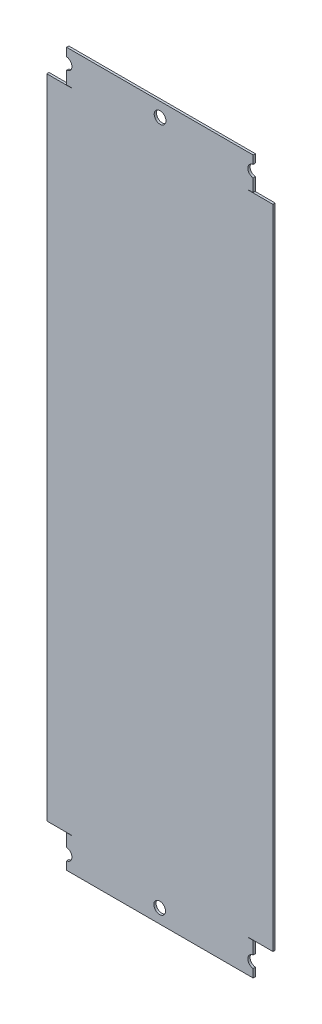
ISO-10303-21;
HEADER;
FILE_DESCRIPTION(('STEP AP214'),'2;1');
FILE_NAME('part.step','',(''),(''),'','','');
FILE_SCHEMA(('AUTOMOTIVE_DESIGN { 1 0 10303 214 1 1 1 1 }'));
ENDSEC;
DATA;
#1=APPLICATION_CONTEXT('core data for automotive mechanical design processes');
#2=APPLICATION_PROTOCOL_DEFINITION('international standard','automotive_design',2000,#1);
#3=PRODUCT_CONTEXT('',#1,'mechanical');
#4=PRODUCT('Part','Part','',(#3));
#5=PRODUCT_RELATED_PRODUCT_CATEGORY('part','',(#4));
#6=PRODUCT_DEFINITION_FORMATION('','',#4);
#7=PRODUCT_DEFINITION_CONTEXT('part definition',#1,'design');
#8=PRODUCT_DEFINITION('design','',#6,#7);
#9=PRODUCT_DEFINITION_SHAPE('','',#8);
#10=(LENGTH_UNIT() NAMED_UNIT(*) SI_UNIT(.MILLI.,.METRE.));
#11=(NAMED_UNIT(*) PLANE_ANGLE_UNIT() SI_UNIT($,.RADIAN.));
#12=(NAMED_UNIT(*) SI_UNIT($,.STERADIAN.) SOLID_ANGLE_UNIT());
#13=UNCERTAINTY_MEASURE_WITH_UNIT(LENGTH_MEASURE(1.E-05),#10,'distance_accuracy_value','');
#14=(GEOMETRIC_REPRESENTATION_CONTEXT(3) GLOBAL_UNCERTAINTY_ASSIGNED_CONTEXT((#13)) GLOBAL_UNIT_ASSIGNED_CONTEXT((#10,
#11,#12)) REPRESENTATION_CONTEXT('',''));
#15=CARTESIAN_POINT('',(0.,0.,0.));
#16=DIRECTION('',(0.,0.,1.));
#17=DIRECTION('',(1.,0.,0.));
#18=AXIS2_PLACEMENT_3D('',#15,#16,#17);
#19=CARTESIAN_POINT('',(0.,0.,-1.524));
#20=DIRECTION('',(0.,0.,-1.));
#21=DIRECTION('',(-1.,0.,0.));
#22=AXIS2_PLACEMENT_3D('',#19,#20,#21);
#23=PLANE('',#22);
#24=CARTESIAN_POINT('',(-0.127000000000016,-231.775,-1.524));
#25=DIRECTION('',(0.,0.,1.));
#26=DIRECTION('',(1.,0.,0.));
#27=AXIS2_PLACEMENT_3D('',#24,#25,#26);
#28=CIRCLE('',#27,3.96240000000002);
#29=CARTESIAN_POINT('',(3.8354,-231.775,-1.524));
#30=VERTEX_POINT('',#29);
#31=EDGE_CURVE('E504',#30,#30,#28,.T.);
#32=ORIENTED_EDGE('',*,*,#31,.T.);
#33=EDGE_LOOP('',(#32));
#34=FACE_BOUND('',#33,.T.);
#35=CARTESIAN_POINT('',(0.126999999999988,231.775,-1.524));
#36=DIRECTION('',(0.,0.,1.));
#37=DIRECTION('',(1.,0.,0.));
#38=AXIS2_PLACEMENT_3D('',#35,#36,#37);
#39=CIRCLE('',#38,3.96240000000002);
#40=CARTESIAN_POINT('',(4.08940000000001,231.775,-1.524));
#41=VERTEX_POINT('',#40);
#42=EDGE_CURVE('E512',#41,#41,#39,.T.);
#43=ORIENTED_EDGE('',*,*,#42,.T.);
#44=EDGE_LOOP('',(#43));
#45=FACE_BOUND('',#44,.T.);
#46=DIRECTION('',(0.,1.,0.));
#47=VECTOR('',#46,1.);
#48=CARTESIAN_POINT('',(63.119,-241.3,-1.524));
#49=LINE('',#48,#47);
#50=CARTESIAN_POINT('',(63.119,235.716503875426,-1.52400000000056));
#51=VERTEX_POINT('',#50);
#52=CARTESIAN_POINT('',(63.119,241.3,-1.524));
#53=VERTEX_POINT('',#52);
#54=EDGE_CURVE('E526',#51,#53,#49,.T.);
#55=ORIENTED_EDGE('',*,*,#54,.F.);
#56=CARTESIAN_POINT('',(63.5254,231.775,-1.52400000000056));
#57=DIRECTION('',(0.,0.,1.));
#58=DIRECTION('',(1.,0.,0.));
#59=AXIS2_PLACEMENT_3D('',#56,#57,#58);
#60=CIRCLE('',#59,3.96240000000001);
#61=CARTESIAN_POINT('',(63.119,227.833496124574,-1.52400000000056));
#62=VERTEX_POINT('',#61);
#63=EDGE_CURVE('E354',#62,#51,#60,.F.);
#64=ORIENTED_EDGE('',*,*,#63,.F.);
#65=CARTESIAN_POINT('',(63.119,219.2274,-1.524));
#66=VERTEX_POINT('',#65);
#67=EDGE_CURVE('E527',#66,#62,#49,.T.);
#68=ORIENTED_EDGE('',*,*,#67,.F.);
#69=DIRECTION('',(-1.,0.,0.));
#70=VECTOR('',#69,1.);
#71=CARTESIAN_POINT('',(0.,219.2274,-1.524));
#72=LINE('',#71,#70);
#73=CARTESIAN_POINT('',(59.9186,219.2274,-1.524));
#74=VERTEX_POINT('',#73);
#75=EDGE_CURVE('E500',#66,#74,#72,.T.);
#76=ORIENTED_EDGE('',*,*,#75,.T.);
#77=DIRECTION('',(0.,-1.,0.));
#78=VECTOR('',#77,1.);
#79=CARTESIAN_POINT('',(59.9186,0.,-1.524));
#80=LINE('',#79,#78);
#81=CARTESIAN_POINT('',(59.9186,219.075,-1.524));
#82=VERTEX_POINT('',#81);
#83=EDGE_CURVE('E497',#74,#82,#80,.T.);
#84=ORIENTED_EDGE('',*,*,#83,.T.);
#85=DIRECTION('',(1.,0.,0.));
#86=VECTOR('',#85,1.);
#87=CARTESIAN_POINT('',(0.,219.075,-1.524));
#88=LINE('',#87,#86);
#89=CARTESIAN_POINT('',(76.5679625310124,219.075,-1.52400000000008));
#90=VERTEX_POINT('',#89);
#91=EDGE_CURVE('E494',#82,#90,#88,.T.);
#92=ORIENTED_EDGE('',*,*,#91,.T.);
#93=DIRECTION('',(0.,-1.,0.));
#94=VECTOR('',#93,1.);
#95=CARTESIAN_POINT('',(76.5679625310124,0.,-1.52400000000009));
#96=LINE('',#95,#94);
#97=CARTESIAN_POINT('',(76.5679625310124,-219.075,-1.52400000000011));
#98=VERTEX_POINT('',#97);
#99=EDGE_CURVE('E299',#90,#98,#96,.T.);
#100=ORIENTED_EDGE('',*,*,#99,.T.);
#101=DIRECTION('',(-1.,0.,0.));
#102=VECTOR('',#101,1.);
#103=CARTESIAN_POINT('',(0.,-219.075,-1.524));
#104=LINE('',#103,#102);
#105=CARTESIAN_POINT('',(59.9186,-219.075,-1.524));
#106=VERTEX_POINT('',#105);
#107=EDGE_CURVE('E491',#98,#106,#104,.T.);
#108=ORIENTED_EDGE('',*,*,#107,.T.);
#109=DIRECTION('',(0.,-1.,0.));
#110=VECTOR('',#109,1.);
#111=CARTESIAN_POINT('',(59.9186,0.,-1.524));
#112=LINE('',#111,#110);
#113=CARTESIAN_POINT('',(59.9186,-219.2274,-1.524));
#114=VERTEX_POINT('',#113);
#115=EDGE_CURVE('E488',#106,#114,#112,.T.);
#116=ORIENTED_EDGE('',*,*,#115,.T.);
#117=DIRECTION('',(1.,0.,0.));
#118=VECTOR('',#117,1.);
#119=CARTESIAN_POINT('',(0.,-219.2274,-1.524));
#120=LINE('',#119,#118);
#121=CARTESIAN_POINT('',(63.119,-219.2274,-1.524));
#122=VERTEX_POINT('',#121);
#123=EDGE_CURVE('E452',#114,#122,#120,.T.);
#124=ORIENTED_EDGE('',*,*,#123,.T.);
#125=CARTESIAN_POINT('',(63.119,-227.833496124574,-1.52400000000056));
#126=VERTEX_POINT('',#125);
#127=EDGE_CURVE('E525',#126,#122,#49,.T.);
#128=ORIENTED_EDGE('',*,*,#127,.F.);
#129=CARTESIAN_POINT('',(63.5254000000001,-231.775,-1.52400000000056));
#130=DIRECTION('',(0.,0.,1.));
#131=DIRECTION('',(1.,0.,0.));
#132=AXIS2_PLACEMENT_3D('',#129,#130,#131);
#133=CIRCLE('',#132,3.96240000000001);
#134=CARTESIAN_POINT('',(63.119,-235.716503875426,-1.52400000000056));
#135=VERTEX_POINT('',#134);
#136=EDGE_CURVE('E340',#135,#126,#133,.F.);
#137=ORIENTED_EDGE('',*,*,#136,.F.);
#138=CARTESIAN_POINT('',(63.119,-241.3,-1.524));
#139=VERTEX_POINT('',#138);
#140=EDGE_CURVE('E520',#139,#135,#49,.T.);
#141=ORIENTED_EDGE('',*,*,#140,.F.);
#142=DIRECTION('',(1.,0.,0.));
#143=VECTOR('',#142,1.);
#144=CARTESIAN_POINT('',(-63.119,-241.3,-1.524));
#145=LINE('',#144,#143);
#146=CARTESIAN_POINT('',(-63.119,-241.3,-1.524));
#147=VERTEX_POINT('',#146);
#148=EDGE_CURVE('E536',#147,#139,#145,.T.);
#149=ORIENTED_EDGE('',*,*,#148,.F.);
#150=DIRECTION('',(0.,-1.,0.));
#151=VECTOR('',#150,1.);
#152=CARTESIAN_POINT('',(-63.119,-241.3,-1.524));
#153=LINE('',#152,#151);
#154=CARTESIAN_POINT('',(-63.119,-235.716503875426,-1.52400000000056));
#155=VERTEX_POINT('',#154);
#156=EDGE_CURVE('E531',#155,#147,#153,.T.);
#157=ORIENTED_EDGE('',*,*,#156,.F.);
#158=CARTESIAN_POINT('',(-63.5254,-231.775,-1.52400000000056));
#159=DIRECTION('',(0.,0.,1.));
#160=DIRECTION('',(1.,0.,0.));
#161=AXIS2_PLACEMENT_3D('',#158,#159,#160);
#162=CIRCLE('',#161,3.96240000000001);
#163=CARTESIAN_POINT('',(-63.119,-227.833496124574,-1.52400000000056));
#164=VERTEX_POINT('',#163);
#165=EDGE_CURVE('E327',#155,#164,#162,.T.);
#166=ORIENTED_EDGE('',*,*,#165,.T.);
#167=CARTESIAN_POINT('',(-63.119,-219.2274,-1.524));
#168=VERTEX_POINT('',#167);
#169=EDGE_CURVE('E538',#168,#164,#153,.T.);
#170=ORIENTED_EDGE('',*,*,#169,.F.);
#171=DIRECTION('',(1.,0.,0.));
#172=VECTOR('',#171,1.);
#173=CARTESIAN_POINT('',(0.,-219.2274,-1.524));
#174=LINE('',#173,#172);
#175=CARTESIAN_POINT('',(-59.9186,-219.2274,-1.524));
#176=VERTEX_POINT('',#175);
#177=EDGE_CURVE('E428',#168,#176,#174,.T.);
#178=ORIENTED_EDGE('',*,*,#177,.T.);
#179=DIRECTION('',(0.,1.,0.));
#180=VECTOR('',#179,1.);
#181=CARTESIAN_POINT('',(-59.9186,0.,-1.524));
#182=LINE('',#181,#180);
#183=CARTESIAN_POINT('',(-59.9186,-219.075,-1.524));
#184=VERTEX_POINT('',#183);
#185=EDGE_CURVE('E443',#176,#184,#182,.T.);
#186=ORIENTED_EDGE('',*,*,#185,.T.);
#187=DIRECTION('',(-1.,0.,0.));
#188=VECTOR('',#187,1.);
#189=CARTESIAN_POINT('',(0.,-219.075,-1.524));
#190=LINE('',#189,#188);
#191=CARTESIAN_POINT('',(-76.567962531013,-219.075,-1.52400000000064));
#192=VERTEX_POINT('',#191);
#193=EDGE_CURVE('E440',#184,#192,#190,.T.);
#194=ORIENTED_EDGE('',*,*,#193,.T.);
#195=DIRECTION('',(0.,1.,0.));
#196=VECTOR('',#195,1.);
#197=CARTESIAN_POINT('',(-76.567962531013,0.,-1.52400000000065));
#198=LINE('',#197,#196);
#199=CARTESIAN_POINT('',(-76.567962531013,219.075,-1.52400000000066));
#200=VERTEX_POINT('',#199);
#201=EDGE_CURVE('E314',#192,#200,#198,.T.);
#202=ORIENTED_EDGE('',*,*,#201,.T.);
#203=DIRECTION('',(1.,0.,0.));
#204=VECTOR('',#203,1.);
#205=CARTESIAN_POINT('',(0.,219.075,-1.524));
#206=LINE('',#205,#204);
#207=CARTESIAN_POINT('',(-59.9186,219.075,-1.524));
#208=VERTEX_POINT('',#207);
#209=EDGE_CURVE('E436',#200,#208,#206,.T.);
#210=ORIENTED_EDGE('',*,*,#209,.T.);
#211=DIRECTION('',(0.,1.,0.));
#212=VECTOR('',#211,1.);
#213=CARTESIAN_POINT('',(-59.9186,0.,-1.524));
#214=LINE('',#213,#212);
#215=CARTESIAN_POINT('',(-59.9186,219.2274,-1.524));
#216=VERTEX_POINT('',#215);
#217=EDGE_CURVE('E432',#208,#216,#214,.T.);
#218=ORIENTED_EDGE('',*,*,#217,.T.);
#219=DIRECTION('',(-1.,0.,0.));
#220=VECTOR('',#219,1.);
#221=CARTESIAN_POINT('',(0.,219.2274,-1.524));
#222=LINE('',#221,#220);
#223=CARTESIAN_POINT('',(-63.119,219.2274,-1.524));
#224=VERTEX_POINT('',#223);
#225=EDGE_CURVE('E382',#216,#224,#222,.T.);
#226=ORIENTED_EDGE('',*,*,#225,.T.);
#227=CARTESIAN_POINT('',(-63.119,227.833496124574,-1.52400000000056));
#228=VERTEX_POINT('',#227);
#229=EDGE_CURVE('E537',#228,#224,#153,.T.);
#230=ORIENTED_EDGE('',*,*,#229,.F.);
#231=CARTESIAN_POINT('',(-63.5254,231.775,-1.52400000000056));
#232=DIRECTION('',(0.,0.,1.));
#233=DIRECTION('',(1.,0.,0.));
#234=AXIS2_PLACEMENT_3D('',#231,#232,#233);
#235=CIRCLE('',#234,3.96240000000001);
#236=CARTESIAN_POINT('',(-63.119,235.716503875426,-1.52400000000056));
#237=VERTEX_POINT('',#236);
#238=EDGE_CURVE('E365',#228,#237,#235,.T.);
#239=ORIENTED_EDGE('',*,*,#238,.T.);
#240=CARTESIAN_POINT('',(-63.119,241.3,-1.524));
#241=VERTEX_POINT('',#240);
#242=EDGE_CURVE('E532',#241,#237,#153,.T.);
#243=ORIENTED_EDGE('',*,*,#242,.F.);
#244=DIRECTION('',(-1.,0.,0.));
#245=VECTOR('',#244,1.);
#246=CARTESIAN_POINT('',(-63.119,241.3,-1.524));
#247=LINE('',#246,#245);
#248=EDGE_CURVE('E524',#53,#241,#247,.T.);
#249=ORIENTED_EDGE('',*,*,#248,.F.);
#250=EDGE_LOOP('',(#55,#64,#68,#76,#84,#92,#100,#108,#116,#124,#128,#137,#141,#149,#157,#166,
#170,#178,#186,#194,#202,#210,#218,#226,#230,#239,#243,#249));
#251=FACE_BOUND('',#250,.T.);
#252=ADVANCED_FACE('F91',(#34,#45,#251),#23,.T.);
#253=CARTESIAN_POINT('',(0.,0.,0.));
#254=DIRECTION('',(0.,0.,-1.));
#255=DIRECTION('',(-1.,0.,0.));
#256=AXIS2_PLACEMENT_3D('',#253,#254,#255);
#257=PLANE('',#256);
#258=CARTESIAN_POINT('',(-0.127000000000016,-231.775,0.));
#259=DIRECTION('',(0.,0.,1.));
#260=DIRECTION('',(1.,0.,0.));
#261=AXIS2_PLACEMENT_3D('',#258,#259,#260);
#262=CIRCLE('',#261,3.96240000000002);
#263=CARTESIAN_POINT('',(3.8354,-231.775,0.));
#264=VERTEX_POINT('',#263);
#265=EDGE_CURVE('E503',#264,#264,#262,.T.);
#266=ORIENTED_EDGE('',*,*,#265,.F.);
#267=EDGE_LOOP('',(#266));
#268=FACE_BOUND('',#267,.T.);
#269=CARTESIAN_POINT('',(0.126999999999988,231.775,0.));
#270=DIRECTION('',(0.,0.,1.));
#271=DIRECTION('',(1.,0.,0.));
#272=AXIS2_PLACEMENT_3D('',#269,#270,#271);
#273=CIRCLE('',#272,3.96240000000002);
#274=CARTESIAN_POINT('',(4.08940000000001,231.775,0.));
#275=VERTEX_POINT('',#274);
#276=EDGE_CURVE('E508',#275,#275,#273,.T.);
#277=ORIENTED_EDGE('',*,*,#276,.F.);
#278=EDGE_LOOP('',(#277));
#279=FACE_BOUND('',#278,.T.);
#280=CARTESIAN_POINT('',(63.5254,231.775,0.));
#281=DIRECTION('',(0.,0.,1.));
#282=DIRECTION('',(1.,0.,0.));
#283=AXIS2_PLACEMENT_3D('',#280,#281,#282);
#284=CIRCLE('',#283,3.96240000000001);
#285=CARTESIAN_POINT('',(63.119,227.833496124574,0.));
#286=VERTEX_POINT('',#285);
#287=CARTESIAN_POINT('',(63.119,235.716503875426,0.));
#288=VERTEX_POINT('',#287);
#289=EDGE_CURVE('E313',#286,#288,#284,.F.);
#290=ORIENTED_EDGE('',*,*,#289,.T.);
#291=DIRECTION('',(0.,1.,0.));
#292=VECTOR('',#291,1.);
#293=CARTESIAN_POINT('',(63.119,-241.3,0.));
#294=LINE('',#293,#292);
#295=CARTESIAN_POINT('',(63.119,241.3,0.));
#296=VERTEX_POINT('',#295);
#297=EDGE_CURVE('E516',#288,#296,#294,.T.);
#298=ORIENTED_EDGE('',*,*,#297,.T.);
#299=DIRECTION('',(-1.,0.,0.));
#300=VECTOR('',#299,1.);
#301=CARTESIAN_POINT('',(-63.119,241.3,0.));
#302=LINE('',#301,#300);
#303=CARTESIAN_POINT('',(-63.119,241.3,0.));
#304=VERTEX_POINT('',#303);
#305=EDGE_CURVE('E546',#296,#304,#302,.T.);
#306=ORIENTED_EDGE('',*,*,#305,.T.);
#307=DIRECTION('',(0.,-1.,0.));
#308=VECTOR('',#307,1.);
#309=CARTESIAN_POINT('',(-63.119,-241.3,0.));
#310=LINE('',#309,#308);
#311=CARTESIAN_POINT('',(-63.119,235.716503875426,0.));
#312=VERTEX_POINT('',#311);
#313=EDGE_CURVE('E553',#304,#312,#310,.T.);
#314=ORIENTED_EDGE('',*,*,#313,.T.);
#315=CARTESIAN_POINT('',(-63.5254,231.775,0.));
#316=DIRECTION('',(0.,0.,1.));
#317=DIRECTION('',(1.,0.,0.));
#318=AXIS2_PLACEMENT_3D('',#315,#316,#317);
#319=CIRCLE('',#318,3.96240000000001);
#320=CARTESIAN_POINT('',(-63.119,227.833496124574,0.));
#321=VERTEX_POINT('',#320);
#322=EDGE_CURVE('E117',#321,#312,#319,.T.);
#323=ORIENTED_EDGE('',*,*,#322,.F.);
#324=CARTESIAN_POINT('',(-63.119,219.2274,0.));
#325=VERTEX_POINT('',#324);
#326=EDGE_CURVE('E558',#321,#325,#310,.T.);
#327=ORIENTED_EDGE('',*,*,#326,.T.);
#328=DIRECTION('',(-1.,0.,0.));
#329=VECTOR('',#328,1.);
#330=CARTESIAN_POINT('',(-59.9186,219.2274,-5.57930437961041E-13));
#331=LINE('',#330,#329);
#332=CARTESIAN_POINT('',(-59.9186,219.2274,-5.57930437961041E-13));
#333=VERTEX_POINT('',#332);
#334=EDGE_CURVE('E402',#333,#325,#331,.T.);
#335=ORIENTED_EDGE('',*,*,#334,.F.);
#336=DIRECTION('',(0.,1.,0.));
#337=VECTOR('',#336,1.);
#338=CARTESIAN_POINT('',(-59.9186,219.075,-5.57930437961041E-13));
#339=LINE('',#338,#337);
#340=CARTESIAN_POINT('',(-59.9186,219.075,-5.57930437961041E-13));
#341=VERTEX_POINT('',#340);
#342=EDGE_CURVE('E397',#341,#333,#339,.T.);
#343=ORIENTED_EDGE('',*,*,#342,.F.);
#344=DIRECTION('',(1.,0.,0.));
#345=VECTOR('',#344,1.);
#346=CARTESIAN_POINT('',(-60.071,219.075,-5.57930437961041E-13));
#347=LINE('',#346,#345);
#348=CARTESIAN_POINT('',(-76.567962531013,219.075,-6.59194920871187E-13));
#349=VERTEX_POINT('',#348);
#350=EDGE_CURVE('E393',#349,#341,#347,.T.);
#351=ORIENTED_EDGE('',*,*,#350,.F.);
#352=DIRECTION('',(0.,-1.,0.));
#353=VECTOR('',#352,1.);
#354=CARTESIAN_POINT('',(-76.567962531013,219.075,-6.59194920871187E-13));
#355=LINE('',#354,#353);
#356=CARTESIAN_POINT('',(-76.567962531013,-219.075,-6.31439345255558E-13));
#357=VERTEX_POINT('',#356);
#358=EDGE_CURVE('E322',#357,#349,#355,.F.);
#359=ORIENTED_EDGE('',*,*,#358,.F.);
#360=DIRECTION('',(-1.,0.,0.));
#361=VECTOR('',#360,1.);
#362=CARTESIAN_POINT('',(-59.9186,-219.075,-5.26705415393458E-13));
#363=LINE('',#362,#361);
#364=CARTESIAN_POINT('',(-59.9186,-219.075,-5.26705415393458E-13));
#365=VERTEX_POINT('',#364);
#366=EDGE_CURVE('E389',#365,#357,#363,.T.);
#367=ORIENTED_EDGE('',*,*,#366,.F.);
#368=DIRECTION('',(0.,1.,0.));
#369=VECTOR('',#368,1.);
#370=CARTESIAN_POINT('',(-59.9186,-219.2274,-5.26705415393458E-13));
#371=LINE('',#370,#369);
#372=CARTESIAN_POINT('',(-59.9186,-219.2274,-5.26705415393458E-13));
#373=VERTEX_POINT('',#372);
#374=EDGE_CURVE('E384',#373,#365,#371,.T.);
#375=ORIENTED_EDGE('',*,*,#374,.F.);
#376=DIRECTION('',(1.,0.,0.));
#377=VECTOR('',#376,1.);
#378=CARTESIAN_POINT('',(-63.119,-219.2274,-2.63352707696729E-13));
#379=LINE('',#378,#377);
#380=CARTESIAN_POINT('',(-63.119,-219.2274,-2.63352707696729E-13));
#381=VERTEX_POINT('',#380);
#382=EDGE_CURVE('E378',#381,#373,#379,.T.);
#383=ORIENTED_EDGE('',*,*,#382,.F.);
#384=CARTESIAN_POINT('',(-63.119,-227.833496124574,0.));
#385=VERTEX_POINT('',#384);
#386=EDGE_CURVE('E559',#381,#385,#310,.T.);
#387=ORIENTED_EDGE('',*,*,#386,.T.);
#388=CARTESIAN_POINT('',(-63.5254,-231.775,0.));
#389=DIRECTION('',(0.,0.,1.));
#390=DIRECTION('',(1.,0.,0.));
#391=AXIS2_PLACEMENT_3D('',#388,#389,#390);
#392=CIRCLE('',#391,3.96240000000001);
#393=CARTESIAN_POINT('',(-63.119,-235.716503875426,0.));
#394=VERTEX_POINT('',#393);
#395=EDGE_CURVE('E109',#394,#385,#392,.T.);
#396=ORIENTED_EDGE('',*,*,#395,.F.);
#397=CARTESIAN_POINT('',(-63.119,-241.3,0.));
#398=VERTEX_POINT('',#397);
#399=EDGE_CURVE('E552',#394,#398,#310,.T.);
#400=ORIENTED_EDGE('',*,*,#399,.T.);
#401=DIRECTION('',(1.,0.,0.));
#402=VECTOR('',#401,1.);
#403=CARTESIAN_POINT('',(-63.119,-241.3,0.));
#404=LINE('',#403,#402);
#405=CARTESIAN_POINT('',(63.119,-241.3,0.));
#406=VERTEX_POINT('',#405);
#407=EDGE_CURVE('E557',#398,#406,#404,.T.);
#408=ORIENTED_EDGE('',*,*,#407,.T.);
#409=CARTESIAN_POINT('',(63.119,-235.716503875426,0.));
#410=VERTEX_POINT('',#409);
#411=EDGE_CURVE('E542',#406,#410,#294,.T.);
#412=ORIENTED_EDGE('',*,*,#411,.T.);
#413=CARTESIAN_POINT('',(63.5254000000001,-231.775,0.));
#414=DIRECTION('',(0.,0.,1.));
#415=DIRECTION('',(1.,0.,0.));
#416=AXIS2_PLACEMENT_3D('',#413,#414,#415);
#417=CIRCLE('',#416,3.96240000000001);
#418=CARTESIAN_POINT('',(63.119,-227.833496124574,0.));
#419=VERTEX_POINT('',#418);
#420=EDGE_CURVE('E344',#410,#419,#417,.F.);
#421=ORIENTED_EDGE('',*,*,#420,.T.);
#422=CARTESIAN_POINT('',(63.119,-219.2274,0.));
#423=VERTEX_POINT('',#422);
#424=EDGE_CURVE('E547',#419,#423,#294,.T.);
#425=ORIENTED_EDGE('',*,*,#424,.T.);
#426=DIRECTION('',(1.,0.,0.));
#427=VECTOR('',#426,1.);
#428=CARTESIAN_POINT('',(59.9186,-219.2274,0.));
#429=LINE('',#428,#427);
#430=CARTESIAN_POINT('',(59.9186,-219.2274,0.));
#431=VERTEX_POINT('',#430);
#432=EDGE_CURVE('E464',#431,#423,#429,.T.);
#433=ORIENTED_EDGE('',*,*,#432,.F.);
#434=DIRECTION('',(0.,-1.,0.));
#435=VECTOR('',#434,1.);
#436=CARTESIAN_POINT('',(59.9186,-219.075,0.));
#437=LINE('',#436,#435);
#438=CARTESIAN_POINT('',(59.9186,-219.075,0.));
#439=VERTEX_POINT('',#438);
#440=EDGE_CURVE('E459',#439,#431,#437,.T.);
#441=ORIENTED_EDGE('',*,*,#440,.F.);
#442=DIRECTION('',(-1.,0.,0.));
#443=VECTOR('',#442,1.);
#444=CARTESIAN_POINT('',(60.071,-219.075,0.));
#445=LINE('',#444,#443);
#446=CARTESIAN_POINT('',(76.5679625310125,-219.075,-1.04083408558608E-13));
#447=VERTEX_POINT('',#446);
#448=EDGE_CURVE('E304',#447,#439,#445,.T.);
#449=ORIENTED_EDGE('',*,*,#448,.F.);
#450=DIRECTION('',(0.,1.,0.));
#451=VECTOR('',#450,1.);
#452=CARTESIAN_POINT('',(76.5679625310125,-219.075,-1.04083408558608E-13));
#453=LINE('',#452,#451);
#454=CARTESIAN_POINT('',(76.5679625310124,219.075,0.));
#455=VERTEX_POINT('',#454);
#456=EDGE_CURVE('E296',#455,#447,#453,.F.);
#457=ORIENTED_EDGE('',*,*,#456,.F.);
#458=DIRECTION('',(1.,0.,0.));
#459=VECTOR('',#458,1.);
#460=CARTESIAN_POINT('',(59.9186,219.075,0.));
#461=LINE('',#460,#459);
#462=CARTESIAN_POINT('',(59.9186,219.075,0.));
#463=VERTEX_POINT('',#462);
#464=EDGE_CURVE('E278',#463,#455,#461,.T.);
#465=ORIENTED_EDGE('',*,*,#464,.F.);
#466=DIRECTION('',(0.,-1.,0.));
#467=VECTOR('',#466,1.);
#468=CARTESIAN_POINT('',(59.9186,219.2274,0.));
#469=LINE('',#468,#467);
#470=CARTESIAN_POINT('',(59.9186,219.2274,0.));
#471=VERTEX_POINT('',#470);
#472=EDGE_CURVE('E454',#471,#463,#469,.T.);
#473=ORIENTED_EDGE('',*,*,#472,.F.);
#474=DIRECTION('',(-1.,0.,0.));
#475=VECTOR('',#474,1.);
#476=CARTESIAN_POINT('',(63.119,219.2274,0.));
#477=LINE('',#476,#475);
#478=CARTESIAN_POINT('',(63.119,219.2274,0.));
#479=VERTEX_POINT('',#478);
#480=EDGE_CURVE('E448',#479,#471,#477,.T.);
#481=ORIENTED_EDGE('',*,*,#480,.F.);
#482=EDGE_CURVE('E548',#479,#286,#294,.T.);
#483=ORIENTED_EDGE('',*,*,#482,.T.);
#484=EDGE_LOOP('',(#290,#298,#306,#314,#323,#327,#335,#343,#351,#359,#367,#375,#383,#387,#396,
#400,#408,#412,#421,#425,#433,#441,#449,#457,#465,#473,#481,#483));
#485=FACE_BOUND('',#484,.T.);
#486=ADVANCED_FACE('F93',(#268,#279,#485),#257,.F.);
#487=CARTESIAN_POINT('',(-63.119,-241.3,-1.524));
#488=DIRECTION('',(-1.,0.,0.));
#489=DIRECTION('',(0.,0.,1.));
#490=AXIS2_PLACEMENT_3D('',#487,#488,#489);
#491=PLANE('',#490);
#492=DIRECTION('',(0.,0.,1.));
#493=VECTOR('',#492,1.);
#494=CARTESIAN_POINT('',(-63.119,-235.716503875426,-1.52400000000056));
#495=LINE('',#494,#493);
#496=EDGE_CURVE('E331',#155,#394,#495,.T.);
#497=ORIENTED_EDGE('',*,*,#496,.F.);
#498=ORIENTED_EDGE('',*,*,#156,.T.);
#499=DIRECTION('',(0.,0.,1.));
#500=VECTOR('',#499,1.);
#501=CARTESIAN_POINT('',(-63.119,-241.3,-1.524));
#502=LINE('',#501,#500);
#503=EDGE_CURVE('E101',#147,#398,#502,.T.);
#504=ORIENTED_EDGE('',*,*,#503,.T.);
#505=ORIENTED_EDGE('',*,*,#399,.F.);
#506=EDGE_LOOP('',(#497,#498,#504,#505));
#507=FACE_BOUND('',#506,.T.);
#508=ADVANCED_FACE('F630',(#507),#491,.T.);
#509=DIRECTION('',(0.,0.,1.));
#510=VECTOR('',#509,1.);
#511=CARTESIAN_POINT('',(-63.119,227.833496124574,-1.52400000000056));
#512=LINE('',#511,#510);
#513=EDGE_CURVE('E369',#228,#321,#512,.T.);
#514=ORIENTED_EDGE('',*,*,#513,.F.);
#515=ORIENTED_EDGE('',*,*,#229,.T.);
#516=DIRECTION('',(0.,0.,-1.));
#517=VECTOR('',#516,1.);
#518=CARTESIAN_POINT('',(-63.119,219.2274,-2.7896521898052E-13));
#519=LINE('',#518,#517);
#520=EDGE_CURVE('E406',#325,#224,#519,.T.);
#521=ORIENTED_EDGE('',*,*,#520,.F.);
#522=ORIENTED_EDGE('',*,*,#326,.F.);
#523=EDGE_LOOP('',(#514,#515,#521,#522));
#524=FACE_BOUND('',#523,.T.);
#525=ADVANCED_FACE('F651',(#524),#491,.T.);
#526=CARTESIAN_POINT('',(63.119,-241.3,-1.524));
#527=DIRECTION('',(1.,0.,0.));
#528=DIRECTION('',(0.,0.,-1.));
#529=AXIS2_PLACEMENT_3D('',#526,#527,#528);
#530=PLANE('',#529);
#531=ORIENTED_EDGE('',*,*,#297,.F.);
#532=DIRECTION('',(0.,0.,1.));
#533=VECTOR('',#532,1.);
#534=CARTESIAN_POINT('',(63.119,235.716503875426,-1.52400000000056));
#535=LINE('',#534,#533);
#536=EDGE_CURVE('E348',#51,#288,#535,.T.);
#537=ORIENTED_EDGE('',*,*,#536,.F.);
#538=ORIENTED_EDGE('',*,*,#54,.T.);
#539=DIRECTION('',(0.,0.,1.));
#540=VECTOR('',#539,1.);
#541=CARTESIAN_POINT('',(63.119,241.3,-1.524));
#542=LINE('',#541,#540);
#543=EDGE_CURVE('E95',#53,#296,#542,.T.);
#544=ORIENTED_EDGE('',*,*,#543,.T.);
#545=EDGE_LOOP('',(#531,#537,#538,#544));
#546=FACE_BOUND('',#545,.T.);
#547=ADVANCED_FACE('F575',(#546),#530,.T.);
#548=ORIENTED_EDGE('',*,*,#67,.T.);
#549=DIRECTION('',(0.,0.,1.));
#550=VECTOR('',#549,1.);
#551=CARTESIAN_POINT('',(63.119,227.833496124574,-1.52400000000056));
#552=LINE('',#551,#550);
#553=EDGE_CURVE('E357',#62,#286,#552,.T.);
#554=ORIENTED_EDGE('',*,*,#553,.T.);
#555=ORIENTED_EDGE('',*,*,#482,.F.);
#556=DIRECTION('',(0.,0.,-1.));
#557=VECTOR('',#556,1.);
#558=CARTESIAN_POINT('',(63.119,219.2274,0.));
#559=LINE('',#558,#557);
#560=EDGE_CURVE('E453',#479,#66,#559,.T.);
#561=ORIENTED_EDGE('',*,*,#560,.T.);
#562=EDGE_LOOP('',(#548,#554,#555,#561));
#563=FACE_BOUND('',#562,.T.);
#564=ADVANCED_FACE('F613',(#563),#530,.T.);
#565=ORIENTED_EDGE('',*,*,#424,.F.);
#566=DIRECTION('',(0.,0.,1.));
#567=VECTOR('',#566,1.);
#568=CARTESIAN_POINT('',(63.119,-227.833496124574,-1.52400000000056));
#569=LINE('',#568,#567);
#570=EDGE_CURVE('E334',#126,#419,#569,.T.);
#571=ORIENTED_EDGE('',*,*,#570,.F.);
#572=ORIENTED_EDGE('',*,*,#127,.T.);
#573=DIRECTION('',(0.,0.,-1.));
#574=VECTOR('',#573,1.);
#575=CARTESIAN_POINT('',(63.119,-219.2274,0.));
#576=LINE('',#575,#574);
#577=EDGE_CURVE('E468',#423,#122,#576,.T.);
#578=ORIENTED_EDGE('',*,*,#577,.F.);
#579=EDGE_LOOP('',(#565,#571,#572,#578));
#580=FACE_BOUND('',#579,.T.);
#581=ADVANCED_FACE('F589',(#580),#530,.T.);
#582=ORIENTED_EDGE('',*,*,#140,.T.);
#583=DIRECTION('',(0.,0.,1.));
#584=VECTOR('',#583,1.);
#585=CARTESIAN_POINT('',(63.119,-235.716503875426,-1.52400000000056));
#586=LINE('',#585,#584);
#587=EDGE_CURVE('E343',#135,#410,#586,.T.);
#588=ORIENTED_EDGE('',*,*,#587,.T.);
#589=ORIENTED_EDGE('',*,*,#411,.F.);
#590=DIRECTION('',(0.,0.,1.));
#591=VECTOR('',#590,1.);
#592=CARTESIAN_POINT('',(63.119,-241.3,-1.524));
#593=LINE('',#592,#591);
#594=EDGE_CURVE('E13',#139,#406,#593,.T.);
#595=ORIENTED_EDGE('',*,*,#594,.F.);
#596=EDGE_LOOP('',(#582,#588,#589,#595));
#597=FACE_BOUND('',#596,.T.);
#598=ADVANCED_FACE('F638',(#597),#530,.T.);
#599=DIRECTION('',(0.,0.,1.));
#600=VECTOR('',#599,1.);
#601=CARTESIAN_POINT('',(-63.119,-227.833496124574,-1.52400000000056));
#602=LINE('',#601,#600);
#603=EDGE_CURVE('E335',#164,#385,#602,.T.);
#604=ORIENTED_EDGE('',*,*,#603,.T.);
#605=ORIENTED_EDGE('',*,*,#386,.F.);
#606=DIRECTION('',(0.,0.,-1.));
#607=VECTOR('',#606,1.);
#608=CARTESIAN_POINT('',(-63.119,-219.2274,-2.63352707696729E-13));
#609=LINE('',#608,#607);
#610=EDGE_CURVE('E383',#381,#168,#609,.T.);
#611=ORIENTED_EDGE('',*,*,#610,.T.);
#612=ORIENTED_EDGE('',*,*,#169,.T.);
#613=EDGE_LOOP('',(#604,#605,#611,#612));
#614=FACE_BOUND('',#613,.T.);
#615=ADVANCED_FACE('F678',(#614),#491,.T.);
#616=DIRECTION('',(0.,0.,1.));
#617=VECTOR('',#616,1.);
#618=CARTESIAN_POINT('',(-63.119,235.716503875426,-1.52400000000056));
#619=LINE('',#618,#617);
#620=EDGE_CURVE('E372',#237,#312,#619,.T.);
#621=ORIENTED_EDGE('',*,*,#620,.T.);
#622=ORIENTED_EDGE('',*,*,#313,.F.);
#623=DIRECTION('',(0.,0.,1.));
#624=VECTOR('',#623,1.);
#625=CARTESIAN_POINT('',(-63.119,241.3,-1.524));
#626=LINE('',#625,#624);
#627=EDGE_CURVE('E565',#241,#304,#626,.T.);
#628=ORIENTED_EDGE('',*,*,#627,.F.);
#629=ORIENTED_EDGE('',*,*,#242,.T.);
#630=EDGE_LOOP('',(#621,#622,#628,#629));
#631=FACE_BOUND('',#630,.T.);
#632=ADVANCED_FACE('F705',(#631),#491,.T.);
#633=CARTESIAN_POINT('',(-63.119,-241.3,-1.524));
#634=DIRECTION('',(0.,-1.,0.));
#635=DIRECTION('',(0.,0.,-1.));
#636=AXIS2_PLACEMENT_3D('',#633,#634,#635);
#637=PLANE('',#636);
#638=ORIENTED_EDGE('',*,*,#407,.F.);
#639=ORIENTED_EDGE('',*,*,#503,.F.);
#640=ORIENTED_EDGE('',*,*,#148,.T.);
#641=ORIENTED_EDGE('',*,*,#594,.T.);
#642=EDGE_LOOP('',(#638,#639,#640,#641));
#643=FACE_BOUND('',#642,.T.);
#644=ADVANCED_FACE('F634',(#643),#637,.T.);
#645=CARTESIAN_POINT('',(-63.119,241.3,-1.524));
#646=DIRECTION('',(0.,1.,0.));
#647=DIRECTION('',(0.,0.,1.));
#648=AXIS2_PLACEMENT_3D('',#645,#646,#647);
#649=PLANE('',#648);
#650=ORIENTED_EDGE('',*,*,#305,.F.);
#651=ORIENTED_EDGE('',*,*,#543,.F.);
#652=ORIENTED_EDGE('',*,*,#248,.T.);
#653=ORIENTED_EDGE('',*,*,#627,.T.);
#654=EDGE_LOOP('',(#650,#651,#652,#653));
#655=FACE_BOUND('',#654,.T.);
#656=ADVANCED_FACE('F579',(#655),#649,.T.);
#657=CARTESIAN_POINT('',(0.126999999999988,231.775,-1.524));
#658=DIRECTION('',(0.,0.,1.));
#659=DIRECTION('',(1.,0.,0.));
#660=AXIS2_PLACEMENT_3D('',#657,#658,#659);
#661=CYLINDRICAL_SURFACE('',#660,3.96240000000002);
#662=CARTESIAN_POINT('',(4.08940000000001,231.775,-1.524));
#663=CARTESIAN_POINT('',(4.08940000000001,231.775,-1.508125));
#664=CARTESIAN_POINT('',(4.08940000000001,231.775,-1.49225));
#665=CARTESIAN_POINT('',(4.08940000000001,231.775,-1.4605));
#666=CARTESIAN_POINT('',(4.08940000000001,231.775,-1.444625));
#667=CARTESIAN_POINT('',(4.08940000000001,231.775,-1.412875));
#668=CARTESIAN_POINT('',(4.08940000000001,231.775,-1.397));
#669=CARTESIAN_POINT('',(4.08940000000001,231.775,-1.36525));
#670=CARTESIAN_POINT('',(4.08940000000001,231.775,-1.349375));
#671=CARTESIAN_POINT('',(4.08940000000001,231.775,-1.317625));
#672=CARTESIAN_POINT('',(4.08940000000001,231.775,-1.30175));
#673=CARTESIAN_POINT('',(4.08940000000001,231.775,-1.27));
#674=CARTESIAN_POINT('',(4.08940000000001,231.775,-1.254125));
#675=CARTESIAN_POINT('',(4.08940000000001,231.775,-1.222375));
#676=CARTESIAN_POINT('',(4.08940000000001,231.775,-1.2065));
#677=CARTESIAN_POINT('',(4.08940000000001,231.775,-1.17475));
#678=CARTESIAN_POINT('',(4.08940000000001,231.775,-1.158875));
#679=CARTESIAN_POINT('',(4.08940000000001,231.775,-1.127125));
#680=CARTESIAN_POINT('',(4.08940000000001,231.775,-1.11125));
#681=CARTESIAN_POINT('',(4.08940000000001,231.775,-1.0795));
#682=CARTESIAN_POINT('',(4.08940000000001,231.775,-1.063625));
#683=CARTESIAN_POINT('',(4.08940000000001,231.775,-1.031875));
#684=CARTESIAN_POINT('',(4.08940000000001,231.775,-1.016));
#685=CARTESIAN_POINT('',(4.08940000000001,231.775,-0.98425));
#686=CARTESIAN_POINT('',(4.08940000000001,231.775,-0.968375));
#687=CARTESIAN_POINT('',(4.08940000000001,231.775,-0.936625));
#688=CARTESIAN_POINT('',(4.08940000000001,231.775,-0.92075));
#689=CARTESIAN_POINT('',(4.08940000000001,231.775,-0.889));
#690=CARTESIAN_POINT('',(4.08940000000001,231.775,-0.873125));
#691=CARTESIAN_POINT('',(4.08940000000001,231.775,-0.841375));
#692=CARTESIAN_POINT('',(4.08940000000001,231.775,-0.8255));
#693=CARTESIAN_POINT('',(4.08940000000001,231.775,-0.79375));
#694=CARTESIAN_POINT('',(4.08940000000001,231.775,-0.777875));
#695=CARTESIAN_POINT('',(4.08940000000001,231.775,-0.746125));
#696=CARTESIAN_POINT('',(4.08940000000001,231.775,-0.73025));
#697=CARTESIAN_POINT('',(4.08940000000001,231.775,-0.6985));
#698=CARTESIAN_POINT('',(4.08940000000001,231.775,-0.682625));
#699=CARTESIAN_POINT('',(4.08940000000001,231.775,-0.650875));
#700=CARTESIAN_POINT('',(4.08940000000001,231.775,-0.635));
#701=CARTESIAN_POINT('',(4.08940000000001,231.775,-0.60325));
#702=CARTESIAN_POINT('',(4.08940000000001,231.775,-0.587375));
#703=CARTESIAN_POINT('',(4.08940000000001,231.775,-0.555625));
#704=CARTESIAN_POINT('',(4.08940000000001,231.775,-0.53975));
#705=CARTESIAN_POINT('',(4.08940000000001,231.775,-0.508));
#706=CARTESIAN_POINT('',(4.08940000000001,231.775,-0.492125));
#707=CARTESIAN_POINT('',(4.08940000000001,231.775,-0.460375));
#708=CARTESIAN_POINT('',(4.08940000000001,231.775,-0.4445));
#709=CARTESIAN_POINT('',(4.08940000000001,231.775,-0.41275));
#710=CARTESIAN_POINT('',(4.08940000000001,231.775,-0.396875));
#711=CARTESIAN_POINT('',(4.08940000000001,231.775,-0.365125));
#712=CARTESIAN_POINT('',(4.08940000000001,231.775,-0.34925));
#713=CARTESIAN_POINT('',(4.08940000000001,231.775,-0.3175));
#714=CARTESIAN_POINT('',(4.08940000000001,231.775,-0.301625));
#715=CARTESIAN_POINT('',(4.08940000000001,231.775,-0.269875));
#716=CARTESIAN_POINT('',(4.08940000000001,231.775,-0.254));
#717=CARTESIAN_POINT('',(4.08940000000001,231.775,-0.22225));
#718=CARTESIAN_POINT('',(4.08940000000001,231.775,-0.206375));
#719=CARTESIAN_POINT('',(4.08940000000001,231.775,-0.174625));
#720=CARTESIAN_POINT('',(4.08940000000001,231.775,-0.15875));
#721=CARTESIAN_POINT('',(4.08940000000001,231.775,-0.127));
#722=CARTESIAN_POINT('',(4.08940000000001,231.775,-0.111125));
#723=CARTESIAN_POINT('',(4.08940000000001,231.775,-0.079375));
#724=CARTESIAN_POINT('',(4.08940000000001,231.775,-0.0635));
#725=CARTESIAN_POINT('',(4.08940000000001,231.775,-0.0317499999999999));
#726=CARTESIAN_POINT('',(4.08940000000001,231.775,-0.015875));
#727=CARTESIAN_POINT('',(4.08940000000001,231.775,0.));
#728=B_SPLINE_CURVE_WITH_KNOTS('',3,(#662,#663,#664,#665,#666,#667,#668,#669,#670,#671,#672,
#673,#674,#675,#676,#677,#678,#679,#680,#681,#682,#683,#684,#685,#686,#687,#688,#689,#690,#691,
#692,#693,#694,#695,#696,#697,#698,#699,#700,#701,#702,#703,#704,#705,#706,#707,#708,#709,#710,
#711,#712,#713,#714,#715,#716,#717,#718,#719,#720,#721,#722,#723,#724,#725,#726,#727),
.UNSPECIFIED.,.F.,.F.,(4,2,2,2,2,2,2,2,2,2,2,2,2,2,2,2,2,2,2,2,2,2,2,2,2,2,2,2,2,2,2,2,4),(0.,
0.0476249999999999,0.0952499999999998,0.142875,0.1905,0.238125,0.28575,0.333375,0.381,0.428625,
0.47625,0.523875,0.5715,0.619125,0.66675,0.714375,0.762,0.809625,0.85725,0.904875,0.9525,
1.000125,1.04775,1.095375,1.143,1.190625,1.23825,1.285875,1.3335,1.381125,1.42875,1.476375,
1.524),.UNSPECIFIED.);
#729=EDGE_CURVE('BSEAM701',#41,#275,#728,.T.);
#730=ORIENTED_EDGE('',*,*,#42,.F.);
#731=ORIENTED_EDGE('',*,*,#276,.T.);
#732=ORIENTED_EDGE('',*,*,#729,.T.);
#733=ORIENTED_EDGE('',*,*,#729,.F.);
#734=EDGE_LOOP('',(#730,#732,#731,#733));
#735=FACE_BOUND('',#734,.T.);
#736=ADVANCED_FACE('F701',(#735),#661,.F.);
#737=CARTESIAN_POINT('',(-0.127000000000016,-231.775,-1.524));
#738=DIRECTION('',(0.,0.,1.));
#739=DIRECTION('',(1.,0.,0.));
#740=AXIS2_PLACEMENT_3D('',#737,#738,#739);
#741=CYLINDRICAL_SURFACE('',#740,3.96240000000002);
#742=CARTESIAN_POINT('',(3.8354,-231.775,-1.524));
#743=CARTESIAN_POINT('',(3.8354,-231.775,-1.508125));
#744=CARTESIAN_POINT('',(3.8354,-231.775,-1.49225));
#745=CARTESIAN_POINT('',(3.8354,-231.775,-1.4605));
#746=CARTESIAN_POINT('',(3.8354,-231.775,-1.444625));
#747=CARTESIAN_POINT('',(3.8354,-231.775,-1.412875));
#748=CARTESIAN_POINT('',(3.8354,-231.775,-1.397));
#749=CARTESIAN_POINT('',(3.8354,-231.775,-1.36525));
#750=CARTESIAN_POINT('',(3.8354,-231.775,-1.349375));
#751=CARTESIAN_POINT('',(3.8354,-231.775,-1.317625));
#752=CARTESIAN_POINT('',(3.8354,-231.775,-1.30175));
#753=CARTESIAN_POINT('',(3.8354,-231.775,-1.27));
#754=CARTESIAN_POINT('',(3.8354,-231.775,-1.254125));
#755=CARTESIAN_POINT('',(3.8354,-231.775,-1.222375));
#756=CARTESIAN_POINT('',(3.8354,-231.775,-1.2065));
#757=CARTESIAN_POINT('',(3.8354,-231.775,-1.17475));
#758=CARTESIAN_POINT('',(3.8354,-231.775,-1.158875));
#759=CARTESIAN_POINT('',(3.8354,-231.775,-1.127125));
#760=CARTESIAN_POINT('',(3.8354,-231.775,-1.11125));
#761=CARTESIAN_POINT('',(3.8354,-231.775,-1.0795));
#762=CARTESIAN_POINT('',(3.8354,-231.775,-1.063625));
#763=CARTESIAN_POINT('',(3.8354,-231.775,-1.031875));
#764=CARTESIAN_POINT('',(3.8354,-231.775,-1.016));
#765=CARTESIAN_POINT('',(3.8354,-231.775,-0.98425));
#766=CARTESIAN_POINT('',(3.8354,-231.775,-0.968375));
#767=CARTESIAN_POINT('',(3.8354,-231.775,-0.936625));
#768=CARTESIAN_POINT('',(3.8354,-231.775,-0.92075));
#769=CARTESIAN_POINT('',(3.8354,-231.775,-0.889));
#770=CARTESIAN_POINT('',(3.8354,-231.775,-0.873125));
#771=CARTESIAN_POINT('',(3.8354,-231.775,-0.841375));
#772=CARTESIAN_POINT('',(3.8354,-231.775,-0.8255));
#773=CARTESIAN_POINT('',(3.8354,-231.775,-0.79375));
#774=CARTESIAN_POINT('',(3.8354,-231.775,-0.777875));
#775=CARTESIAN_POINT('',(3.8354,-231.775,-0.746125));
#776=CARTESIAN_POINT('',(3.8354,-231.775,-0.73025));
#777=CARTESIAN_POINT('',(3.8354,-231.775,-0.6985));
#778=CARTESIAN_POINT('',(3.8354,-231.775,-0.682625));
#779=CARTESIAN_POINT('',(3.8354,-231.775,-0.650875));
#780=CARTESIAN_POINT('',(3.8354,-231.775,-0.635));
#781=CARTESIAN_POINT('',(3.8354,-231.775,-0.60325));
#782=CARTESIAN_POINT('',(3.8354,-231.775,-0.587375));
#783=CARTESIAN_POINT('',(3.8354,-231.775,-0.555625));
#784=CARTESIAN_POINT('',(3.8354,-231.775,-0.53975));
#785=CARTESIAN_POINT('',(3.8354,-231.775,-0.508));
#786=CARTESIAN_POINT('',(3.8354,-231.775,-0.492125));
#787=CARTESIAN_POINT('',(3.8354,-231.775,-0.460375));
#788=CARTESIAN_POINT('',(3.8354,-231.775,-0.4445));
#789=CARTESIAN_POINT('',(3.8354,-231.775,-0.41275));
#790=CARTESIAN_POINT('',(3.8354,-231.775,-0.396875));
#791=CARTESIAN_POINT('',(3.8354,-231.775,-0.365125));
#792=CARTESIAN_POINT('',(3.8354,-231.775,-0.34925));
#793=CARTESIAN_POINT('',(3.8354,-231.775,-0.3175));
#794=CARTESIAN_POINT('',(3.8354,-231.775,-0.301625));
#795=CARTESIAN_POINT('',(3.8354,-231.775,-0.269875));
#796=CARTESIAN_POINT('',(3.8354,-231.775,-0.254));
#797=CARTESIAN_POINT('',(3.8354,-231.775,-0.22225));
#798=CARTESIAN_POINT('',(3.8354,-231.775,-0.206375));
#799=CARTESIAN_POINT('',(3.8354,-231.775,-0.174625));
#800=CARTESIAN_POINT('',(3.8354,-231.775,-0.15875));
#801=CARTESIAN_POINT('',(3.8354,-231.775,-0.127));
#802=CARTESIAN_POINT('',(3.8354,-231.775,-0.111125));
#803=CARTESIAN_POINT('',(3.8354,-231.775,-0.079375));
#804=CARTESIAN_POINT('',(3.8354,-231.775,-0.0635));
#805=CARTESIAN_POINT('',(3.8354,-231.775,-0.0317499999999999));
#806=CARTESIAN_POINT('',(3.8354,-231.775,-0.015875));
#807=CARTESIAN_POINT('',(3.8354,-231.775,0.));
#808=B_SPLINE_CURVE_WITH_KNOTS('',3,(#742,#743,#744,#745,#746,#747,#748,#749,#750,#751,#752,
#753,#754,#755,#756,#757,#758,#759,#760,#761,#762,#763,#764,#765,#766,#767,#768,#769,#770,#771,
#772,#773,#774,#775,#776,#777,#778,#779,#780,#781,#782,#783,#784,#785,#786,#787,#788,#789,#790,
#791,#792,#793,#794,#795,#796,#797,#798,#799,#800,#801,#802,#803,#804,#805,#806,#807),
.UNSPECIFIED.,.F.,.F.,(4,2,2,2,2,2,2,2,2,2,2,2,2,2,2,2,2,2,2,2,2,2,2,2,2,2,2,2,2,2,2,2,4),(0.,
0.0476249999999999,0.0952499999999998,0.142875,0.1905,0.238125,0.28575,0.333375,0.381,0.428625,
0.47625,0.523875,0.5715,0.619125,0.66675,0.714375,0.762,0.809625,0.85725,0.904875,0.9525,
1.000125,1.04775,1.095375,1.143,1.190625,1.23825,1.285875,1.3335,1.381125,1.42875,1.476375,
1.524),.UNSPECIFIED.);
#809=EDGE_CURVE('BSEAM977',#30,#264,#808,.T.);
#810=ORIENTED_EDGE('',*,*,#31,.F.);
#811=ORIENTED_EDGE('',*,*,#265,.T.);
#812=ORIENTED_EDGE('',*,*,#809,.T.);
#813=ORIENTED_EDGE('',*,*,#809,.F.);
#814=EDGE_LOOP('',(#810,#812,#811,#813));
#815=FACE_BOUND('',#814,.T.);
#816=ADVANCED_FACE('F977',(#815),#741,.F.);
#817=CARTESIAN_POINT('',(63.119,219.2274,0.));
#818=DIRECTION('',(0.,-1.,0.));
#819=DIRECTION('',(0.,0.,-1.));
#820=AXIS2_PLACEMENT_3D('',#817,#818,#819);
#821=PLANE('',#820);
#822=ORIENTED_EDGE('',*,*,#75,.F.);
#823=ORIENTED_EDGE('',*,*,#560,.F.);
#824=ORIENTED_EDGE('',*,*,#480,.T.);
#825=DIRECTION('',(0.,0.,-1.));
#826=VECTOR('',#825,1.);
#827=CARTESIAN_POINT('',(59.9186,219.2274,0.));
#828=LINE('',#827,#826);
#829=EDGE_CURVE('E290',#471,#74,#828,.T.);
#830=ORIENTED_EDGE('',*,*,#829,.T.);
#831=EDGE_LOOP('',(#822,#823,#824,#830));
#832=FACE_BOUND('',#831,.T.);
#833=ADVANCED_FACE('F616',(#832),#821,.T.);
#834=CARTESIAN_POINT('',(59.9186,219.2274,0.));
#835=DIRECTION('',(1.,0.,0.));
#836=DIRECTION('',(0.,0.,-1.));
#837=AXIS2_PLACEMENT_3D('',#834,#835,#836);
#838=PLANE('',#837);
#839=ORIENTED_EDGE('',*,*,#83,.F.);
#840=ORIENTED_EDGE('',*,*,#829,.F.);
#841=ORIENTED_EDGE('',*,*,#472,.T.);
#842=DIRECTION('',(0.,0.,-1.));
#843=VECTOR('',#842,1.);
#844=CARTESIAN_POINT('',(59.9186,219.075,0.));
#845=LINE('',#844,#843);
#846=EDGE_CURVE('E285',#463,#82,#845,.T.);
#847=ORIENTED_EDGE('',*,*,#846,.T.);
#848=EDGE_LOOP('',(#839,#840,#841,#847));
#849=FACE_BOUND('',#848,.T.);
#850=ADVANCED_FACE('F606',(#849),#838,.T.);
#851=CARTESIAN_POINT('',(59.9186,219.075,0.));
#852=DIRECTION('',(0.,1.,0.));
#853=DIRECTION('',(0.,0.,1.));
#854=AXIS2_PLACEMENT_3D('',#851,#852,#853);
#855=PLANE('',#854);
#856=ORIENTED_EDGE('',*,*,#91,.F.);
#857=ORIENTED_EDGE('',*,*,#846,.F.);
#858=ORIENTED_EDGE('',*,*,#464,.T.);
#859=DIRECTION('',(0.,0.,1.));
#860=VECTOR('',#859,1.);
#861=CARTESIAN_POINT('',(76.5679625310124,219.075,-1.52400000000008));
#862=LINE('',#861,#860);
#863=EDGE_CURVE('E282',#90,#455,#862,.T.);
#864=ORIENTED_EDGE('',*,*,#863,.F.);
#865=EDGE_LOOP('',(#856,#857,#858,#864));
#866=FACE_BOUND('',#865,.T.);
#867=ADVANCED_FACE('F281',(#866),#855,.T.);
#868=CARTESIAN_POINT('',(60.071,-219.075,0.));
#869=DIRECTION('',(0.,-1.,0.));
#870=DIRECTION('',(0.,0.,-1.));
#871=AXIS2_PLACEMENT_3D('',#868,#869,#870);
#872=PLANE('',#871);
#873=ORIENTED_EDGE('',*,*,#107,.F.);
#874=DIRECTION('',(0.,0.,1.));
#875=VECTOR('',#874,1.);
#876=CARTESIAN_POINT('',(76.5679625310124,-219.075,-1.52400000000011));
#877=LINE('',#876,#875);
#878=EDGE_CURVE('E326',#98,#447,#877,.T.);
#879=ORIENTED_EDGE('',*,*,#878,.T.);
#880=ORIENTED_EDGE('',*,*,#448,.T.);
#881=DIRECTION('',(0.,0.,-1.));
#882=VECTOR('',#881,1.);
#883=CARTESIAN_POINT('',(59.9186,-219.075,0.));
#884=LINE('',#883,#882);
#885=EDGE_CURVE('E463',#439,#106,#884,.T.);
#886=ORIENTED_EDGE('',*,*,#885,.T.);
#887=EDGE_LOOP('',(#873,#879,#880,#886));
#888=FACE_BOUND('',#887,.T.);
#889=ADVANCED_FACE('F599',(#888),#872,.T.);
#890=CARTESIAN_POINT('',(59.9186,-219.075,0.));
#891=DIRECTION('',(1.,0.,0.));
#892=DIRECTION('',(0.,0.,-1.));
#893=AXIS2_PLACEMENT_3D('',#890,#891,#892);
#894=PLANE('',#893);
#895=ORIENTED_EDGE('',*,*,#115,.F.);
#896=ORIENTED_EDGE('',*,*,#885,.F.);
#897=ORIENTED_EDGE('',*,*,#440,.T.);
#898=DIRECTION('',(0.,0.,-1.));
#899=VECTOR('',#898,1.);
#900=CARTESIAN_POINT('',(59.9186,-219.2274,0.));
#901=LINE('',#900,#899);
#902=EDGE_CURVE('E447',#431,#114,#901,.T.);
#903=ORIENTED_EDGE('',*,*,#902,.T.);
#904=EDGE_LOOP('',(#895,#896,#897,#903));
#905=FACE_BOUND('',#904,.T.);
#906=ADVANCED_FACE('F597',(#905),#894,.T.);
#907=CARTESIAN_POINT('',(59.9186,-219.2274,0.));
#908=DIRECTION('',(0.,1.,0.));
#909=DIRECTION('',(0.,0.,1.));
#910=AXIS2_PLACEMENT_3D('',#907,#908,#909);
#911=PLANE('',#910);
#912=ORIENTED_EDGE('',*,*,#123,.F.);
#913=ORIENTED_EDGE('',*,*,#902,.F.);
#914=ORIENTED_EDGE('',*,*,#432,.T.);
#915=ORIENTED_EDGE('',*,*,#577,.T.);
#916=EDGE_LOOP('',(#912,#913,#914,#915));
#917=FACE_BOUND('',#916,.T.);
#918=ADVANCED_FACE('F593',(#917),#911,.T.);
#919=CARTESIAN_POINT('',(-63.119,-219.2274,-2.63352707696729E-13));
#920=DIRECTION('',(0.,1.,0.));
#921=DIRECTION('',(0.,0.,1.));
#922=AXIS2_PLACEMENT_3D('',#919,#920,#921);
#923=PLANE('',#922);
#924=ORIENTED_EDGE('',*,*,#177,.F.);
#925=ORIENTED_EDGE('',*,*,#610,.F.);
#926=ORIENTED_EDGE('',*,*,#382,.T.);
#927=DIRECTION('',(0.,0.,-1.));
#928=VECTOR('',#927,1.);
#929=CARTESIAN_POINT('',(-59.9186,-219.2274,-5.26705415393458E-13));
#930=LINE('',#929,#928);
#931=EDGE_CURVE('E388',#373,#176,#930,.T.);
#932=ORIENTED_EDGE('',*,*,#931,.T.);
#933=EDGE_LOOP('',(#924,#925,#926,#932));
#934=FACE_BOUND('',#933,.T.);
#935=ADVANCED_FACE('F676',(#934),#923,.T.);
#936=CARTESIAN_POINT('',(-59.9186,-219.2274,-5.26705415393458E-13));
#937=DIRECTION('',(-1.,0.,0.));
#938=DIRECTION('',(0.,0.,1.));
#939=AXIS2_PLACEMENT_3D('',#936,#937,#938);
#940=PLANE('',#939);
#941=ORIENTED_EDGE('',*,*,#185,.F.);
#942=ORIENTED_EDGE('',*,*,#931,.F.);
#943=ORIENTED_EDGE('',*,*,#374,.T.);
#944=DIRECTION('',(0.,0.,-1.));
#945=VECTOR('',#944,1.);
#946=CARTESIAN_POINT('',(-59.9186,-219.075,-5.26705415393458E-13));
#947=LINE('',#946,#945);
#948=EDGE_CURVE('E392',#365,#184,#947,.T.);
#949=ORIENTED_EDGE('',*,*,#948,.T.);
#950=EDGE_LOOP('',(#941,#942,#943,#949));
#951=FACE_BOUND('',#950,.T.);
#952=ADVANCED_FACE('F674',(#951),#940,.T.);
#953=CARTESIAN_POINT('',(-59.9186,-219.075,-5.26705415393458E-13));
#954=DIRECTION('',(0.,-1.,0.));
#955=DIRECTION('',(0.,0.,-1.));
#956=AXIS2_PLACEMENT_3D('',#953,#954,#955);
#957=PLANE('',#956);
#958=ORIENTED_EDGE('',*,*,#193,.F.);
#959=ORIENTED_EDGE('',*,*,#948,.F.);
#960=ORIENTED_EDGE('',*,*,#366,.T.);
#961=DIRECTION('',(0.,0.,1.));
#962=VECTOR('',#961,1.);
#963=CARTESIAN_POINT('',(-76.567962531013,-219.075,-1.52400000000064));
#964=LINE('',#963,#962);
#965=EDGE_CURVE('E318',#192,#357,#964,.T.);
#966=ORIENTED_EDGE('',*,*,#965,.F.);
#967=EDGE_LOOP('',(#958,#959,#960,#966));
#968=FACE_BOUND('',#967,.T.);
#969=ADVANCED_FACE('F669',(#968),#957,.T.);
#970=CARTESIAN_POINT('',(-60.071,219.075,-5.57930437961041E-13));
#971=DIRECTION('',(0.,1.,0.));
#972=DIRECTION('',(0.,0.,1.));
#973=AXIS2_PLACEMENT_3D('',#970,#971,#972);
#974=PLANE('',#973);
#975=ORIENTED_EDGE('',*,*,#209,.F.);
#976=DIRECTION('',(0.,0.,1.));
#977=VECTOR('',#976,1.);
#978=CARTESIAN_POINT('',(-76.567962531013,219.075,-1.52400000000066));
#979=LINE('',#978,#977);
#980=EDGE_CURVE('E309',#200,#349,#979,.T.);
#981=ORIENTED_EDGE('',*,*,#980,.T.);
#982=ORIENTED_EDGE('',*,*,#350,.T.);
#983=DIRECTION('',(0.,0.,-1.));
#984=VECTOR('',#983,1.);
#985=CARTESIAN_POINT('',(-59.9186,219.075,-5.57930437961041E-13));
#986=LINE('',#985,#984);
#987=EDGE_CURVE('E401',#341,#208,#986,.T.);
#988=ORIENTED_EDGE('',*,*,#987,.T.);
#989=EDGE_LOOP('',(#975,#981,#982,#988));
#990=FACE_BOUND('',#989,.T.);
#991=ADVANCED_FACE('F659',(#990),#974,.T.);
#992=CARTESIAN_POINT('',(-59.9186,219.075,-5.57930437961041E-13));
#993=DIRECTION('',(-1.,0.,0.));
#994=DIRECTION('',(0.,0.,1.));
#995=AXIS2_PLACEMENT_3D('',#992,#993,#994);
#996=PLANE('',#995);
#997=ORIENTED_EDGE('',*,*,#217,.F.);
#998=ORIENTED_EDGE('',*,*,#987,.F.);
#999=ORIENTED_EDGE('',*,*,#342,.T.);
#1000=DIRECTION('',(0.,0.,-1.));
#1001=VECTOR('',#1000,1.);
#1002=CARTESIAN_POINT('',(-59.9186,219.2274,-5.57930437961041E-13));
#1003=LINE('',#1002,#1001);
#1004=EDGE_CURVE('E375',#333,#216,#1003,.T.);
#1005=ORIENTED_EDGE('',*,*,#1004,.T.);
#1006=EDGE_LOOP('',(#997,#998,#999,#1005));
#1007=FACE_BOUND('',#1006,.T.);
#1008=ADVANCED_FACE('F657',(#1007),#996,.T.);
#1009=CARTESIAN_POINT('',(-59.9186,219.2274,-5.57930437961041E-13));
#1010=DIRECTION('',(0.,-1.,0.));
#1011=DIRECTION('',(0.,0.,-1.));
#1012=AXIS2_PLACEMENT_3D('',#1009,#1010,#1011);
#1013=PLANE('',#1012);
#1014=ORIENTED_EDGE('',*,*,#225,.F.);
#1015=ORIENTED_EDGE('',*,*,#1004,.F.);
#1016=ORIENTED_EDGE('',*,*,#334,.T.);
#1017=ORIENTED_EDGE('',*,*,#520,.T.);
#1018=EDGE_LOOP('',(#1014,#1015,#1016,#1017));
#1019=FACE_BOUND('',#1018,.T.);
#1020=ADVANCED_FACE('F654',(#1019),#1013,.T.);
#1021=CARTESIAN_POINT('',(63.5254000000001,-231.775,-1.52400000000056));
#1022=DIRECTION('',(0.,0.,1.));
#1023=DIRECTION('',(1.,0.,0.));
#1024=AXIS2_PLACEMENT_3D('',#1021,#1022,#1023);
#1025=CYLINDRICAL_SURFACE('',#1024,3.96240000000001);
#1026=ORIENTED_EDGE('',*,*,#420,.F.);
#1027=ORIENTED_EDGE('',*,*,#587,.F.);
#1028=ORIENTED_EDGE('',*,*,#136,.T.);
#1029=ORIENTED_EDGE('',*,*,#570,.T.);
#1030=EDGE_LOOP('',(#1026,#1027,#1028,#1029));
#1031=FACE_BOUND('',#1030,.T.);
#1032=ADVANCED_FACE('F641',(#1031),#1025,.F.);
#1033=CARTESIAN_POINT('',(63.5254,231.775,-1.52400000000056));
#1034=DIRECTION('',(0.,0.,1.));
#1035=DIRECTION('',(1.,0.,0.));
#1036=AXIS2_PLACEMENT_3D('',#1033,#1034,#1035);
#1037=CYLINDRICAL_SURFACE('',#1036,3.96240000000001);
#1038=ORIENTED_EDGE('',*,*,#289,.F.);
#1039=ORIENTED_EDGE('',*,*,#553,.F.);
#1040=ORIENTED_EDGE('',*,*,#63,.T.);
#1041=ORIENTED_EDGE('',*,*,#536,.T.);
#1042=EDGE_LOOP('',(#1038,#1039,#1040,#1041));
#1043=FACE_BOUND('',#1042,.T.);
#1044=ADVANCED_FACE('F688',(#1043),#1037,.F.);
#1045=CARTESIAN_POINT('',(-63.5254,231.775,-1.52400000000056));
#1046=DIRECTION('',(0.,0.,1.));
#1047=DIRECTION('',(1.,0.,0.));
#1048=AXIS2_PLACEMENT_3D('',#1045,#1046,#1047);
#1049=CYLINDRICAL_SURFACE('',#1048,3.96240000000001);
#1050=ORIENTED_EDGE('',*,*,#322,.T.);
#1051=ORIENTED_EDGE('',*,*,#620,.F.);
#1052=ORIENTED_EDGE('',*,*,#238,.F.);
#1053=ORIENTED_EDGE('',*,*,#513,.T.);
#1054=EDGE_LOOP('',(#1050,#1051,#1052,#1053));
#1055=FACE_BOUND('',#1054,.T.);
#1056=ADVANCED_FACE('F681',(#1055),#1049,.F.);
#1057=CARTESIAN_POINT('',(-63.5254,-231.775,-1.52400000000056));
#1058=DIRECTION('',(0.,0.,1.));
#1059=DIRECTION('',(1.,0.,0.));
#1060=AXIS2_PLACEMENT_3D('',#1057,#1058,#1059);
#1061=CYLINDRICAL_SURFACE('',#1060,3.96240000000001);
#1062=ORIENTED_EDGE('',*,*,#395,.T.);
#1063=ORIENTED_EDGE('',*,*,#603,.F.);
#1064=ORIENTED_EDGE('',*,*,#165,.F.);
#1065=ORIENTED_EDGE('',*,*,#496,.T.);
#1066=EDGE_LOOP('',(#1062,#1063,#1064,#1065));
#1067=FACE_BOUND('',#1066,.T.);
#1068=ADVANCED_FACE('F679',(#1067),#1061,.F.);
#1069=CARTESIAN_POINT('',(-76.567962531013,219.075,-1.52400000000066));
#1070=DIRECTION('',(1.,0.,0.));
#1071=DIRECTION('',(0.,0.,-1.));
#1072=AXIS2_PLACEMENT_3D('',#1069,#1070,#1071);
#1073=PLANE('',#1072);
#1074=ORIENTED_EDGE('',*,*,#358,.T.);
#1075=ORIENTED_EDGE('',*,*,#980,.F.);
#1076=ORIENTED_EDGE('',*,*,#201,.F.);
#1077=ORIENTED_EDGE('',*,*,#965,.T.);
#1078=EDGE_LOOP('',(#1074,#1075,#1076,#1077));
#1079=FACE_BOUND('',#1078,.T.);
#1080=ADVANCED_FACE('F665',(#1079),#1073,.F.);
#1081=CARTESIAN_POINT('',(76.5679625310124,-219.075,-1.52400000000011));
#1082=DIRECTION('',(-1.,0.,0.));
#1083=DIRECTION('',(0.,0.,1.));
#1084=AXIS2_PLACEMENT_3D('',#1081,#1082,#1083);
#1085=PLANE('',#1084);
#1086=ORIENTED_EDGE('',*,*,#456,.T.);
#1087=ORIENTED_EDGE('',*,*,#878,.F.);
#1088=ORIENTED_EDGE('',*,*,#99,.F.);
#1089=ORIENTED_EDGE('',*,*,#863,.T.);
#1090=EDGE_LOOP('',(#1086,#1087,#1088,#1089));
#1091=FACE_BOUND('',#1090,.T.);
#1092=ADVANCED_FACE('F294',(#1091),#1085,.F.);
#1093=CLOSED_SHELL('',(#252,#486,#508,#525,#547,#564,#581,#598,#615,#632,#644,#656,#736,#816,
#833,#850,#867,#889,#906,#918,#935,#952,#969,#991,#1008,#1020,#1032,#1044,#1056,#1068,#1080,#1092));
#1094=MANIFOLD_SOLID_BREP('B2',#1093);
#1095=ADVANCED_BREP_SHAPE_REPRESENTATION('',(#18,#1094),#14);
#1096=SHAPE_DEFINITION_REPRESENTATION(#9,#1095);
ENDSEC;
END-ISO-10303-21;
